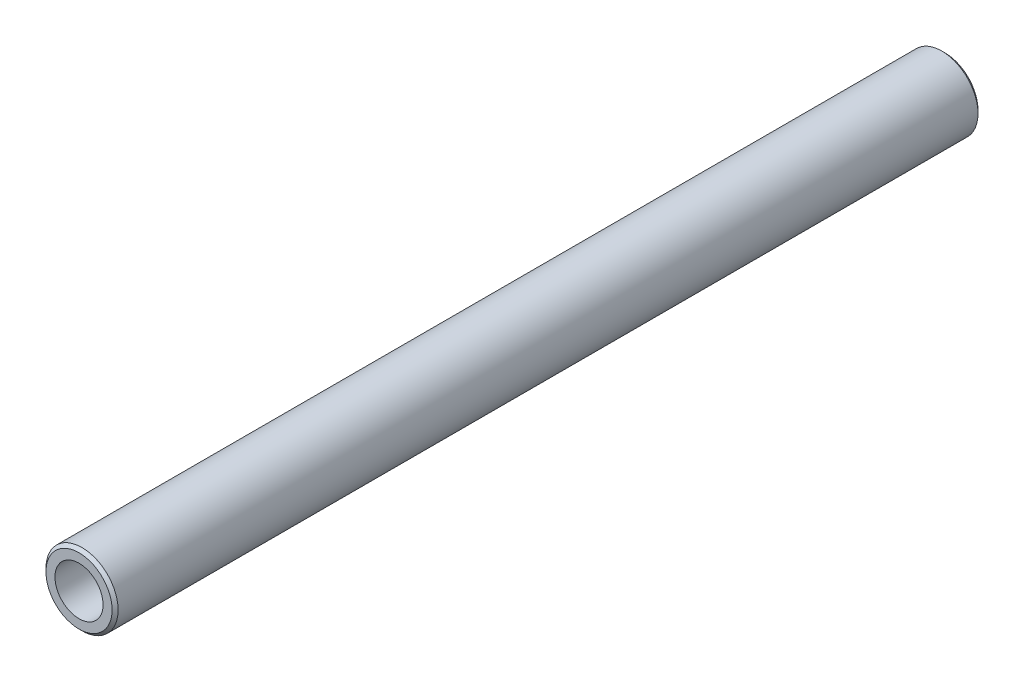
ISO-10303-21;
HEADER;
FILE_DESCRIPTION(('STEP AP214'),'2;1');
FILE_NAME('part.step','',(''),(''),'','','');
FILE_SCHEMA(('AUTOMOTIVE_DESIGN { 1 0 10303 214 1 1 1 1 }'));
ENDSEC;
DATA;
#1=APPLICATION_CONTEXT('core data for automotive mechanical design processes');
#2=APPLICATION_PROTOCOL_DEFINITION('international standard','automotive_design',2000,#1);
#3=PRODUCT_CONTEXT('',#1,'mechanical');
#4=PRODUCT('Part','Part','',(#3));
#5=PRODUCT_RELATED_PRODUCT_CATEGORY('part','',(#4));
#6=PRODUCT_DEFINITION_FORMATION('','',#4);
#7=PRODUCT_DEFINITION_CONTEXT('part definition',#1,'design');
#8=PRODUCT_DEFINITION('design','',#6,#7);
#9=PRODUCT_DEFINITION_SHAPE('','',#8);
#10=(LENGTH_UNIT() NAMED_UNIT(*) SI_UNIT(.MILLI.,.METRE.));
#11=(NAMED_UNIT(*) PLANE_ANGLE_UNIT() SI_UNIT($,.RADIAN.));
#12=(NAMED_UNIT(*) SI_UNIT($,.STERADIAN.) SOLID_ANGLE_UNIT());
#13=UNCERTAINTY_MEASURE_WITH_UNIT(LENGTH_MEASURE(1.E-05),#10,'distance_accuracy_value','');
#14=(GEOMETRIC_REPRESENTATION_CONTEXT(3) GLOBAL_UNCERTAINTY_ASSIGNED_CONTEXT((#13)) GLOBAL_UNIT_ASSIGNED_CONTEXT((#10,
#11,#12)) REPRESENTATION_CONTEXT('',''));
#15=CARTESIAN_POINT('',(0.,0.,0.));
#16=DIRECTION('',(0.,0.,1.));
#17=DIRECTION('',(1.,0.,0.));
#18=AXIS2_PLACEMENT_3D('',#15,#16,#17);
#19=CARTESIAN_POINT('',(0.,0.,36.));
#20=DIRECTION('',(0.,0.,-1.));
#21=DIRECTION('',(-1.,0.,0.));
#22=AXIS2_PLACEMENT_3D('',#19,#20,#21);
#23=CYLINDRICAL_SURFACE('',#22,3.);
#24=CARTESIAN_POINT('',(0.,0.,-35.75));
#25=DIRECTION('',(0.,0.,1.));
#26=DIRECTION('',(1.,0.,0.));
#27=AXIS2_PLACEMENT_3D('',#24,#25,#26);
#28=CIRCLE('',#27,3.);
#29=CARTESIAN_POINT('',(3.,0.,-35.75));
#30=VERTEX_POINT('',#29);
#31=EDGE_CURVE('E45',#30,#30,#28,.T.);
#32=ORIENTED_EDGE('',*,*,#31,.T.);
#33=EDGE_LOOP('',(#32));
#34=FACE_BOUND('',#33,.T.);
#35=CARTESIAN_POINT('',(0.,0.,35.75));
#36=DIRECTION('',(0.,0.,1.));
#37=DIRECTION('',(1.,0.,0.));
#38=AXIS2_PLACEMENT_3D('',#35,#36,#37);
#39=CIRCLE('',#38,3.);
#40=CARTESIAN_POINT('',(3.,0.,35.75));
#41=VERTEX_POINT('',#40);
#42=EDGE_CURVE('E49',#41,#41,#39,.F.);
#43=ORIENTED_EDGE('',*,*,#42,.T.);
#44=EDGE_LOOP('',(#43));
#45=FACE_BOUND('',#44,.T.);
#46=ADVANCED_FACE('F34',(#34,#45),#23,.T.);
#47=CARTESIAN_POINT('',(0.,0.,36.));
#48=DIRECTION('',(0.,0.,1.));
#49=DIRECTION('',(1.,0.,0.));
#50=AXIS2_PLACEMENT_3D('',#47,#48,#49);
#51=PLANE('',#50);
#52=CARTESIAN_POINT('',(0.,0.,36.));
#53=DIRECTION('',(0.,0.,1.));
#54=DIRECTION('',(1.,0.,0.));
#55=AXIS2_PLACEMENT_3D('',#52,#53,#54);
#56=CIRCLE('',#55,2.);
#57=CARTESIAN_POINT('',(2.,0.,36.));
#58=VERTEX_POINT('',#57);
#59=EDGE_CURVE('E55',#58,#58,#56,.T.);
#60=ORIENTED_EDGE('',*,*,#59,.F.);
#61=EDGE_LOOP('',(#60));
#62=FACE_BOUND('',#61,.T.);
#63=CARTESIAN_POINT('',(0.,0.,36.));
#64=DIRECTION('',(0.,0.,1.));
#65=DIRECTION('',(1.,0.,0.));
#66=AXIS2_PLACEMENT_3D('',#63,#64,#65);
#67=CIRCLE('',#66,2.75);
#68=CARTESIAN_POINT('',(2.75,0.,36.));
#69=VERTEX_POINT('',#68);
#70=EDGE_CURVE('E10',#69,#69,#67,.T.);
#71=ORIENTED_EDGE('',*,*,#70,.T.);
#72=EDGE_LOOP('',(#71));
#73=FACE_BOUND('',#72,.T.);
#74=ADVANCED_FACE('F79',(#62,#73),#51,.T.);
#75=CARTESIAN_POINT('',(0.,0.,-36.));
#76=DIRECTION('',(0.,0.,1.));
#77=DIRECTION('',(1.,0.,0.));
#78=AXIS2_PLACEMENT_3D('',#75,#76,#77);
#79=PLANE('',#78);
#80=CARTESIAN_POINT('',(0.,0.,-36.));
#81=DIRECTION('',(0.,0.,1.));
#82=DIRECTION('',(1.,0.,0.));
#83=AXIS2_PLACEMENT_3D('',#80,#81,#82);
#84=CIRCLE('',#83,2.);
#85=CARTESIAN_POINT('',(2.,0.,-36.));
#86=VERTEX_POINT('',#85);
#87=EDGE_CURVE('E61',#86,#86,#84,.T.);
#88=ORIENTED_EDGE('',*,*,#87,.T.);
#89=EDGE_LOOP('',(#88));
#90=FACE_BOUND('',#89,.T.);
#91=CARTESIAN_POINT('',(0.,0.,-36.));
#92=DIRECTION('',(0.,0.,1.));
#93=DIRECTION('',(1.,0.,0.));
#94=AXIS2_PLACEMENT_3D('',#91,#92,#93);
#95=CIRCLE('',#94,2.75);
#96=CARTESIAN_POINT('',(2.75,0.,-36.));
#97=VERTEX_POINT('',#96);
#98=EDGE_CURVE('E41',#97,#97,#95,.F.);
#99=ORIENTED_EDGE('',*,*,#98,.T.);
#100=EDGE_LOOP('',(#99));
#101=FACE_BOUND('',#100,.T.);
#102=ADVANCED_FACE('F85',(#90,#101),#79,.F.);
#103=CARTESIAN_POINT('',(0.,0.,-35.75));
#104=DIRECTION('',(0.,0.,1.));
#105=DIRECTION('',(1.,0.,0.));
#106=AXIS2_PLACEMENT_3D('',#103,#104,#105);
#107=CONICAL_SURFACE('',#106,3.,0.785398163397458);
#108=ORIENTED_EDGE('',*,*,#98,.F.);
#109=EDGE_LOOP('',(#108));
#110=FACE_BOUND('',#109,.T.);
#111=ORIENTED_EDGE('',*,*,#31,.F.);
#112=EDGE_LOOP('',(#111));
#113=FACE_BOUND('',#112,.T.);
#114=ADVANCED_FACE('F90',(#110,#113),#107,.T.);
#115=CARTESIAN_POINT('',(0.,0.,36.));
#116=DIRECTION('',(0.,0.,-1.));
#117=DIRECTION('',(-1.,0.,0.));
#118=AXIS2_PLACEMENT_3D('',#115,#116,#117);
#119=CONICAL_SURFACE('',#118,2.75,0.785398163397444);
#120=ORIENTED_EDGE('',*,*,#42,.F.);
#121=EDGE_LOOP('',(#120));
#122=FACE_BOUND('',#121,.T.);
#123=ORIENTED_EDGE('',*,*,#70,.F.);
#124=EDGE_LOOP('',(#123));
#125=FACE_BOUND('',#124,.T.);
#126=ADVANCED_FACE('F36',(#122,#125),#119,.T.);
#127=CARTESIAN_POINT('',(0.,0.,20.));
#128=DIRECTION('',(0.,0.,1.));
#129=DIRECTION('',(1.,0.,0.));
#130=AXIS2_PLACEMENT_3D('',#127,#128,#129);
#131=CYLINDRICAL_SURFACE('',#130,2.);
#132=CARTESIAN_POINT('',(0.,0.,20.));
#133=DIRECTION('',(0.,0.,1.));
#134=DIRECTION('',(1.,0.,0.));
#135=AXIS2_PLACEMENT_3D('',#132,#133,#134);
#136=CIRCLE('',#135,2.);
#137=CARTESIAN_POINT('',(2.,0.,20.));
#138=VERTEX_POINT('',#137);
#139=EDGE_CURVE('E54',#138,#138,#136,.T.);
#140=ORIENTED_EDGE('',*,*,#139,.F.);
#141=EDGE_LOOP('',(#140));
#142=FACE_BOUND('',#141,.T.);
#143=ORIENTED_EDGE('',*,*,#59,.T.);
#144=EDGE_LOOP('',(#143));
#145=FACE_BOUND('',#144,.T.);
#146=ADVANCED_FACE('F97',(#142,#145),#131,.F.);
#147=CARTESIAN_POINT('',(0.,0.,20.));
#148=DIRECTION('',(0.,0.,1.));
#149=DIRECTION('',(1.,0.,0.));
#150=AXIS2_PLACEMENT_3D('',#147,#148,#149);
#151=PLANE('',#150);
#152=ORIENTED_EDGE('',*,*,#139,.T.);
#153=EDGE_LOOP('',(#152));
#154=FACE_BOUND('',#153,.T.);
#155=ADVANCED_FACE('F76',(#154),#151,.T.);
#156=CARTESIAN_POINT('',(0.,0.,-20.));
#157=DIRECTION('',(0.,0.,-1.));
#158=DIRECTION('',(-1.,0.,0.));
#159=AXIS2_PLACEMENT_3D('',#156,#157,#158);
#160=CYLINDRICAL_SURFACE('',#159,2.);
#161=CARTESIAN_POINT('',(0.,0.,-20.));
#162=DIRECTION('',(0.,0.,1.));
#163=DIRECTION('',(1.,0.,0.));
#164=AXIS2_PLACEMENT_3D('',#161,#162,#163);
#165=CIRCLE('',#164,2.);
#166=CARTESIAN_POINT('',(2.,0.,-20.));
#167=VERTEX_POINT('',#166);
#168=EDGE_CURVE('E58',#167,#167,#165,.T.);
#169=ORIENTED_EDGE('',*,*,#168,.T.);
#170=EDGE_LOOP('',(#169));
#171=FACE_BOUND('',#170,.T.);
#172=ORIENTED_EDGE('',*,*,#87,.F.);
#173=EDGE_LOOP('',(#172));
#174=FACE_BOUND('',#173,.T.);
#175=ADVANCED_FACE('F67',(#171,#174),#160,.F.);
#176=CARTESIAN_POINT('',(0.,0.,-20.));
#177=DIRECTION('',(0.,0.,-1.));
#178=DIRECTION('',(1.,0.,0.));
#179=AXIS2_PLACEMENT_3D('',#176,#177,#178);
#180=PLANE('',#179);
#181=ORIENTED_EDGE('',*,*,#168,.F.);
#182=EDGE_LOOP('',(#181));
#183=FACE_BOUND('',#182,.T.);
#184=ADVANCED_FACE('F70',(#183),#180,.T.);
#185=CLOSED_SHELL('',(#46,#74,#102,#114,#126,#146,#155,#175,#184));
#186=MANIFOLD_SOLID_BREP('B2',#185);
#187=ADVANCED_BREP_SHAPE_REPRESENTATION('',(#18,#186),#14);
#188=SHAPE_DEFINITION_REPRESENTATION(#9,#187);
ENDSEC;
END-ISO-10303-21;
